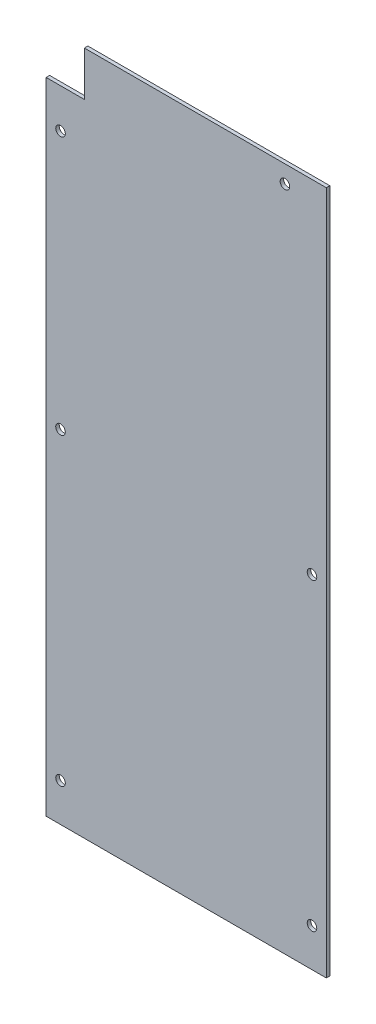
ISO-10303-21;
HEADER;
FILE_DESCRIPTION(('STEP AP214'),'2;1');
FILE_NAME('part.step','',(''),(''),'','','');
FILE_SCHEMA(('AUTOMOTIVE_DESIGN { 1 0 10303 214 1 1 1 1 }'));
ENDSEC;
DATA;
#1=APPLICATION_CONTEXT('core data for automotive mechanical design processes');
#2=APPLICATION_PROTOCOL_DEFINITION('international standard','automotive_design',2000,#1);
#3=PRODUCT_CONTEXT('',#1,'mechanical');
#4=PRODUCT('Part','Part','',(#3));
#5=PRODUCT_RELATED_PRODUCT_CATEGORY('part','',(#4));
#6=PRODUCT_DEFINITION_FORMATION('','',#4);
#7=PRODUCT_DEFINITION_CONTEXT('part definition',#1,'design');
#8=PRODUCT_DEFINITION('design','',#6,#7);
#9=PRODUCT_DEFINITION_SHAPE('','',#8);
#10=(LENGTH_UNIT() NAMED_UNIT(*) SI_UNIT(.MILLI.,.METRE.));
#11=(NAMED_UNIT(*) PLANE_ANGLE_UNIT() SI_UNIT($,.RADIAN.));
#12=(NAMED_UNIT(*) SI_UNIT($,.STERADIAN.) SOLID_ANGLE_UNIT());
#13=UNCERTAINTY_MEASURE_WITH_UNIT(LENGTH_MEASURE(1.E-05),#10,'distance_accuracy_value','');
#14=(GEOMETRIC_REPRESENTATION_CONTEXT(3) GLOBAL_UNCERTAINTY_ASSIGNED_CONTEXT((#13)) GLOBAL_UNIT_ASSIGNED_CONTEXT((#10,
#11,#12)) REPRESENTATION_CONTEXT('',''));
#15=CARTESIAN_POINT('',(0.,0.,0.));
#16=DIRECTION('',(0.,0.,1.));
#17=DIRECTION('',(1.,0.,0.));
#18=AXIS2_PLACEMENT_3D('',#15,#16,#17);
#19=CARTESIAN_POINT('',(-43.4054880311596,36.5751828079822,1.1));
#20=DIRECTION('',(1.,0.,0.));
#21=DIRECTION('',(0.,0.,-1.));
#22=AXIS2_PLACEMENT_3D('',#19,#20,#21);
#23=PLANE('',#22);
#24=DIRECTION('',(0.,-1.,0.));
#25=VECTOR('',#24,1.);
#26=CARTESIAN_POINT('',(-43.4054880311596,36.5751828079822,1.1));
#27=LINE('',#26,#25);
#28=CARTESIAN_POINT('',(-43.4054880311596,22.5761319376729,1.1));
#29=VERTEX_POINT('',#28);
#30=CARTESIAN_POINT('',(-43.4054880311596,-178.424817192018,1.1));
#31=VERTEX_POINT('',#30);
#32=EDGE_CURVE('E92',#29,#31,#27,.T.);
#33=ORIENTED_EDGE('',*,*,#32,.F.);
#34=DIRECTION('',(0.,0.,1.));
#35=VECTOR('',#34,1.);
#36=CARTESIAN_POINT('',(-43.4054880311596,22.5761319376729,0.));
#37=LINE('',#36,#35);
#38=CARTESIAN_POINT('',(-43.4054880311596,22.5761319376729,0.));
#39=VERTEX_POINT('',#38);
#40=EDGE_CURVE('E110',#39,#29,#37,.T.);
#41=ORIENTED_EDGE('',*,*,#40,.F.);
#42=DIRECTION('',(0.,-1.,0.));
#43=VECTOR('',#42,1.);
#44=CARTESIAN_POINT('',(-43.4054880311596,36.5751828079822,0.));
#45=LINE('',#44,#43);
#46=CARTESIAN_POINT('',(-43.4054880311596,-178.424817192018,0.));
#47=VERTEX_POINT('',#46);
#48=EDGE_CURVE('E118',#39,#47,#45,.T.);
#49=ORIENTED_EDGE('',*,*,#48,.T.);
#50=DIRECTION('',(0.,0.,-1.));
#51=VECTOR('',#50,1.);
#52=CARTESIAN_POINT('',(-43.4054880311596,-178.424817192018,1.1));
#53=LINE('',#52,#51);
#54=EDGE_CURVE('E12',#31,#47,#53,.T.);
#55=ORIENTED_EDGE('',*,*,#54,.F.);
#56=EDGE_LOOP('',(#33,#41,#49,#55));
#57=FACE_BOUND('',#56,.T.);
#58=ADVANCED_FACE('F44',(#57),#23,.F.);
#59=CARTESIAN_POINT('',(-43.4054880311596,-178.424817192018,1.1));
#60=DIRECTION('',(0.,1.,0.));
#61=DIRECTION('',(-1.,0.,0.));
#62=AXIS2_PLACEMENT_3D('',#59,#60,#61);
#63=PLANE('',#62);
#64=DIRECTION('',(1.,0.,0.));
#65=VECTOR('',#64,1.);
#66=CARTESIAN_POINT('',(-43.4054880311596,-178.424817192018,0.));
#67=LINE('',#66,#65);
#68=CARTESIAN_POINT('',(44.5945119688404,-178.424817192018,0.));
#69=VERTEX_POINT('',#68);
#70=EDGE_CURVE('E123',#47,#69,#67,.T.);
#71=ORIENTED_EDGE('',*,*,#70,.T.);
#72=DIRECTION('',(0.,0.,-1.));
#73=VECTOR('',#72,1.);
#74=CARTESIAN_POINT('',(44.5945119688404,-178.424817192018,1.1));
#75=LINE('',#74,#73);
#76=CARTESIAN_POINT('',(44.5945119688404,-178.424817192018,1.1));
#77=VERTEX_POINT('',#76);
#78=EDGE_CURVE('E53',#77,#69,#75,.T.);
#79=ORIENTED_EDGE('',*,*,#78,.F.);
#80=DIRECTION('',(1.,0.,0.));
#81=VECTOR('',#80,1.);
#82=CARTESIAN_POINT('',(-43.4054880311596,-178.424817192018,1.1));
#83=LINE('',#82,#81);
#84=EDGE_CURVE('E146',#31,#77,#83,.T.);
#85=ORIENTED_EDGE('',*,*,#84,.F.);
#86=ORIENTED_EDGE('',*,*,#54,.T.);
#87=EDGE_LOOP('',(#71,#79,#85,#86));
#88=FACE_BOUND('',#87,.T.);
#89=ADVANCED_FACE('F243',(#88),#63,.F.);
#90=CARTESIAN_POINT('',(44.5945119688404,36.5751828079822,1.1));
#91=DIRECTION('',(-1.,0.,0.));
#92=DIRECTION('',(0.,0.,1.));
#93=AXIS2_PLACEMENT_3D('',#90,#91,#92);
#94=PLANE('',#93);
#95=DIRECTION('',(0.,1.,0.));
#96=VECTOR('',#95,1.);
#97=CARTESIAN_POINT('',(44.5945119688404,36.5751828079822,0.));
#98=LINE('',#97,#96);
#99=CARTESIAN_POINT('',(44.5945119688404,36.5751828079822,0.));
#100=VERTEX_POINT('',#99);
#101=EDGE_CURVE('E87',#69,#100,#98,.T.);
#102=ORIENTED_EDGE('',*,*,#101,.T.);
#103=DIRECTION('',(0.,0.,-1.));
#104=VECTOR('',#103,1.);
#105=CARTESIAN_POINT('',(44.5945119688404,36.5751828079822,1.1));
#106=LINE('',#105,#104);
#107=CARTESIAN_POINT('',(44.5945119688404,36.5751828079822,1.1));
#108=VERTEX_POINT('',#107);
#109=EDGE_CURVE('E138',#108,#100,#106,.T.);
#110=ORIENTED_EDGE('',*,*,#109,.F.);
#111=DIRECTION('',(0.,1.,0.));
#112=VECTOR('',#111,1.);
#113=CARTESIAN_POINT('',(44.5945119688404,36.5751828079822,1.1));
#114=LINE('',#113,#112);
#115=EDGE_CURVE('E70',#77,#108,#114,.T.);
#116=ORIENTED_EDGE('',*,*,#115,.F.);
#117=ORIENTED_EDGE('',*,*,#78,.T.);
#118=EDGE_LOOP('',(#102,#110,#116,#117));
#119=FACE_BOUND('',#118,.T.);
#120=ADVANCED_FACE('F140',(#119),#94,.F.);
#121=CARTESIAN_POINT('',(-43.4054880311596,36.5751828079822,1.1));
#122=DIRECTION('',(0.,-1.,0.));
#123=DIRECTION('',(0.,0.,-1.));
#124=AXIS2_PLACEMENT_3D('',#121,#122,#123);
#125=PLANE('',#124);
#126=DIRECTION('',(-1.,0.,0.));
#127=VECTOR('',#126,1.);
#128=CARTESIAN_POINT('',(-43.4054880311596,36.5751828079822,0.));
#129=LINE('',#128,#127);
#130=CARTESIAN_POINT('',(-31.4054880311596,36.5751828079822,0.));
#131=VERTEX_POINT('',#130);
#132=EDGE_CURVE('E47',#100,#131,#129,.T.);
#133=ORIENTED_EDGE('',*,*,#132,.T.);
#134=DIRECTION('',(0.,0.,1.));
#135=VECTOR('',#134,1.);
#136=CARTESIAN_POINT('',(-31.4054880311596,36.5751828079822,0.));
#137=LINE('',#136,#135);
#138=CARTESIAN_POINT('',(-31.4054880311596,36.5751828079822,1.1));
#139=VERTEX_POINT('',#138);
#140=EDGE_CURVE('E155',#131,#139,#137,.T.);
#141=ORIENTED_EDGE('',*,*,#140,.T.);
#142=DIRECTION('',(-1.,0.,0.));
#143=VECTOR('',#142,1.);
#144=CARTESIAN_POINT('',(-43.4054880311596,36.5751828079822,1.1));
#145=LINE('',#144,#143);
#146=EDGE_CURVE('E133',#108,#139,#145,.T.);
#147=ORIENTED_EDGE('',*,*,#146,.F.);
#148=ORIENTED_EDGE('',*,*,#109,.T.);
#149=EDGE_LOOP('',(#133,#141,#147,#148));
#150=FACE_BOUND('',#149,.T.);
#151=ADVANCED_FACE('F154',(#150),#125,.F.);
#152=CARTESIAN_POINT('',(0.,0.,1.1));
#153=DIRECTION('',(0.,0.,1.));
#154=DIRECTION('',(1.,0.,0.));
#155=AXIS2_PLACEMENT_3D('',#152,#153,#154);
#156=PLANE('',#155);
#157=CARTESIAN_POINT('',(40.0945119688404,-166.424817192018,1.1));
#158=DIRECTION('',(0.,0.,1.));
#159=DIRECTION('',(1.,0.,0.));
#160=AXIS2_PLACEMENT_3D('',#157,#158,#159);
#161=CIRCLE('',#160,1.5);
#162=CARTESIAN_POINT('',(41.5945119688404,-166.424817192018,1.1));
#163=VERTEX_POINT('',#162);
#164=EDGE_CURVE('E124',#163,#163,#161,.T.);
#165=ORIENTED_EDGE('',*,*,#164,.F.);
#166=EDGE_LOOP('',(#165));
#167=FACE_BOUND('',#166,.T.);
#168=CARTESIAN_POINT('',(40.0945119688404,-70.9248171920178,1.1));
#169=DIRECTION('',(0.,0.,1.));
#170=DIRECTION('',(1.,0.,0.));
#171=AXIS2_PLACEMENT_3D('',#168,#169,#170);
#172=CIRCLE('',#171,1.5);
#173=CARTESIAN_POINT('',(41.5945119688404,-70.9248171920178,1.1));
#174=VERTEX_POINT('',#173);
#175=EDGE_CURVE('E127',#174,#174,#172,.T.);
#176=ORIENTED_EDGE('',*,*,#175,.F.);
#177=EDGE_LOOP('',(#176));
#178=FACE_BOUND('',#177,.T.);
#179=CARTESIAN_POINT('',(-38.9054880311596,10.2551828079822,1.1));
#180=DIRECTION('',(0.,0.,1.));
#181=DIRECTION('',(1.,0.,0.));
#182=AXIS2_PLACEMENT_3D('',#179,#180,#181);
#183=CIRCLE('',#182,1.50000000000198);
#184=CARTESIAN_POINT('',(-37.4054880311576,10.2551828079822,1.1));
#185=VERTEX_POINT('',#184);
#186=EDGE_CURVE('E180',#185,#185,#183,.T.);
#187=ORIENTED_EDGE('',*,*,#186,.F.);
#188=EDGE_LOOP('',(#187));
#189=FACE_BOUND('',#188,.T.);
#190=CARTESIAN_POINT('',(-38.9054880311596,-70.9248171920178,1.1));
#191=DIRECTION('',(0.,0.,1.));
#192=DIRECTION('',(1.,0.,0.));
#193=AXIS2_PLACEMENT_3D('',#190,#191,#192);
#194=CIRCLE('',#193,1.5);
#195=CARTESIAN_POINT('',(-37.4054880311596,-70.9248171920178,1.1));
#196=VERTEX_POINT('',#195);
#197=EDGE_CURVE('E177',#196,#196,#194,.T.);
#198=ORIENTED_EDGE('',*,*,#197,.F.);
#199=EDGE_LOOP('',(#198));
#200=FACE_BOUND('',#199,.T.);
#201=CARTESIAN_POINT('',(-38.9054880311596,-166.424817192018,1.1));
#202=DIRECTION('',(0.,0.,1.));
#203=DIRECTION('',(1.,0.,0.));
#204=AXIS2_PLACEMENT_3D('',#201,#202,#203);
#205=CIRCLE('',#204,1.5);
#206=CARTESIAN_POINT('',(-37.4054880311596,-166.424817192018,1.1));
#207=VERTEX_POINT('',#206);
#208=EDGE_CURVE('E174',#207,#207,#205,.T.);
#209=ORIENTED_EDGE('',*,*,#208,.F.);
#210=EDGE_LOOP('',(#209));
#211=FACE_BOUND('',#210,.T.);
#212=CARTESIAN_POINT('',(31.5945119688404,31.0751828079823,1.1));
#213=DIRECTION('',(0.,0.,1.));
#214=DIRECTION('',(1.,0.,0.));
#215=AXIS2_PLACEMENT_3D('',#212,#213,#214);
#216=CIRCLE('',#215,1.50000000000098);
#217=CARTESIAN_POINT('',(33.0945119688414,31.0751828079823,1.1));
#218=VERTEX_POINT('',#217);
#219=EDGE_CURVE('E171',#218,#218,#216,.T.);
#220=ORIENTED_EDGE('',*,*,#219,.F.);
#221=EDGE_LOOP('',(#220));
#222=FACE_BOUND('',#221,.T.);
#223=DIRECTION('',(0.,1.,0.));
#224=VECTOR('',#223,1.);
#225=CARTESIAN_POINT('',(-31.4054880311596,0.,1.1));
#226=LINE('',#225,#224);
#227=CARTESIAN_POINT('',(-31.4054880311596,22.5761319376729,1.1));
#228=VERTEX_POINT('',#227);
#229=EDGE_CURVE('E153',#228,#139,#226,.T.);
#230=ORIENTED_EDGE('',*,*,#229,.F.);
#231=DIRECTION('',(1.,0.,0.));
#232=VECTOR('',#231,1.);
#233=CARTESIAN_POINT('',(0.,22.5761319376729,1.1));
#234=LINE('',#233,#232);
#235=EDGE_CURVE('E114',#29,#228,#234,.T.);
#236=ORIENTED_EDGE('',*,*,#235,.F.);
#237=ORIENTED_EDGE('',*,*,#32,.T.);
#238=ORIENTED_EDGE('',*,*,#84,.T.);
#239=ORIENTED_EDGE('',*,*,#115,.T.);
#240=ORIENTED_EDGE('',*,*,#146,.T.);
#241=EDGE_LOOP('',(#230,#236,#237,#238,#239,#240));
#242=FACE_BOUND('',#241,.T.);
#243=ADVANCED_FACE('F152',(#167,#178,#189,#200,#211,#222,#242),#156,.T.);
#244=CARTESIAN_POINT('',(0.,0.,0.));
#245=DIRECTION('',(0.,0.,1.));
#246=DIRECTION('',(1.,0.,0.));
#247=AXIS2_PLACEMENT_3D('',#244,#245,#246);
#248=PLANE('',#247);
#249=CARTESIAN_POINT('',(40.0945119688404,-166.424817192018,0.));
#250=DIRECTION('',(0.,0.,1.));
#251=DIRECTION('',(1.,0.,0.));
#252=AXIS2_PLACEMENT_3D('',#249,#250,#251);
#253=CIRCLE('',#252,1.5);
#254=CARTESIAN_POINT('',(41.5945119688404,-166.424817192018,0.));
#255=VERTEX_POINT('',#254);
#256=EDGE_CURVE('E216',#255,#255,#253,.T.);
#257=ORIENTED_EDGE('',*,*,#256,.T.);
#258=EDGE_LOOP('',(#257));
#259=FACE_BOUND('',#258,.T.);
#260=CARTESIAN_POINT('',(40.0945119688404,-70.9248171920178,0.));
#261=DIRECTION('',(0.,0.,1.));
#262=DIRECTION('',(1.,0.,0.));
#263=AXIS2_PLACEMENT_3D('',#260,#261,#262);
#264=CIRCLE('',#263,1.5);
#265=CARTESIAN_POINT('',(41.5945119688404,-70.9248171920178,0.));
#266=VERTEX_POINT('',#265);
#267=EDGE_CURVE('E211',#266,#266,#264,.T.);
#268=ORIENTED_EDGE('',*,*,#267,.T.);
#269=EDGE_LOOP('',(#268));
#270=FACE_BOUND('',#269,.T.);
#271=CARTESIAN_POINT('',(-38.9054880311596,10.2551828079822,0.));
#272=DIRECTION('',(0.,0.,1.));
#273=DIRECTION('',(1.,0.,0.));
#274=AXIS2_PLACEMENT_3D('',#271,#272,#273);
#275=CIRCLE('',#274,1.50000000000198);
#276=CARTESIAN_POINT('',(-37.4054880311576,10.2551828079822,0.));
#277=VERTEX_POINT('',#276);
#278=EDGE_CURVE('E157',#277,#277,#275,.T.);
#279=ORIENTED_EDGE('',*,*,#278,.T.);
#280=EDGE_LOOP('',(#279));
#281=FACE_BOUND('',#280,.T.);
#282=CARTESIAN_POINT('',(-38.9054880311596,-70.9248171920178,0.));
#283=DIRECTION('',(0.,0.,1.));
#284=DIRECTION('',(1.,0.,0.));
#285=AXIS2_PLACEMENT_3D('',#282,#283,#284);
#286=CIRCLE('',#285,1.5);
#287=CARTESIAN_POINT('',(-37.4054880311596,-70.9248171920178,0.));
#288=VERTEX_POINT('',#287);
#289=EDGE_CURVE('E161',#288,#288,#286,.T.);
#290=ORIENTED_EDGE('',*,*,#289,.T.);
#291=EDGE_LOOP('',(#290));
#292=FACE_BOUND('',#291,.T.);
#293=CARTESIAN_POINT('',(-38.9054880311596,-166.424817192018,0.));
#294=DIRECTION('',(0.,0.,1.));
#295=DIRECTION('',(1.,0.,0.));
#296=AXIS2_PLACEMENT_3D('',#293,#294,#295);
#297=CIRCLE('',#296,1.5);
#298=CARTESIAN_POINT('',(-37.4054880311596,-166.424817192018,0.));
#299=VERTEX_POINT('',#298);
#300=EDGE_CURVE('E210',#299,#299,#297,.T.);
#301=ORIENTED_EDGE('',*,*,#300,.T.);
#302=EDGE_LOOP('',(#301));
#303=FACE_BOUND('',#302,.T.);
#304=CARTESIAN_POINT('',(31.5945119688404,31.0751828079823,-4.3298697960376E-13));
#305=DIRECTION('',(0.,0.,1.));
#306=DIRECTION('',(1.,0.,0.));
#307=AXIS2_PLACEMENT_3D('',#304,#305,#306);
#308=CIRCLE('',#307,1.50000000000098);
#309=CARTESIAN_POINT('',(33.0945119688414,31.0751828079823,-4.3298697960376E-13));
#310=VERTEX_POINT('',#309);
#311=EDGE_CURVE('E208',#310,#310,#308,.T.);
#312=ORIENTED_EDGE('',*,*,#311,.T.);
#313=EDGE_LOOP('',(#312));
#314=FACE_BOUND('',#313,.T.);
#315=DIRECTION('',(1.,0.,0.));
#316=VECTOR('',#315,1.);
#317=CARTESIAN_POINT('',(-43.4054880311596,22.5761319376729,0.));
#318=LINE('',#317,#316);
#319=CARTESIAN_POINT('',(-31.4054880311596,22.5761319376729,0.));
#320=VERTEX_POINT('',#319);
#321=EDGE_CURVE('E107',#39,#320,#318,.T.);
#322=ORIENTED_EDGE('',*,*,#321,.T.);
#323=DIRECTION('',(0.,1.,0.));
#324=VECTOR('',#323,1.);
#325=CARTESIAN_POINT('',(-31.4054880311596,36.5751828079822,0.));
#326=LINE('',#325,#324);
#327=EDGE_CURVE('E120',#320,#131,#326,.T.);
#328=ORIENTED_EDGE('',*,*,#327,.T.);
#329=ORIENTED_EDGE('',*,*,#132,.F.);
#330=ORIENTED_EDGE('',*,*,#101,.F.);
#331=ORIENTED_EDGE('',*,*,#70,.F.);
#332=ORIENTED_EDGE('',*,*,#48,.F.);
#333=EDGE_LOOP('',(#322,#328,#329,#330,#331,#332));
#334=FACE_BOUND('',#333,.T.);
#335=ADVANCED_FACE('F122',(#259,#270,#281,#292,#303,#314,#334),#248,.F.);
#336=CARTESIAN_POINT('',(-31.4054880311596,36.5751828079822,0.));
#337=DIRECTION('',(1.,0.,0.));
#338=DIRECTION('',(0.,0.,-1.));
#339=AXIS2_PLACEMENT_3D('',#336,#337,#338);
#340=PLANE('',#339);
#341=ORIENTED_EDGE('',*,*,#229,.T.);
#342=ORIENTED_EDGE('',*,*,#140,.F.);
#343=ORIENTED_EDGE('',*,*,#327,.F.);
#344=DIRECTION('',(0.,0.,1.));
#345=VECTOR('',#344,1.);
#346=CARTESIAN_POINT('',(-31.4054880311596,22.5761319376729,0.));
#347=LINE('',#346,#345);
#348=EDGE_CURVE('E61',#320,#228,#347,.T.);
#349=ORIENTED_EDGE('',*,*,#348,.T.);
#350=EDGE_LOOP('',(#341,#342,#343,#349));
#351=FACE_BOUND('',#350,.T.);
#352=ADVANCED_FACE('F205',(#351),#340,.F.);
#353=CARTESIAN_POINT('',(-43.4054880311596,22.5761319376729,0.));
#354=DIRECTION('',(0.,-1.,0.));
#355=DIRECTION('',(1.,0.,0.));
#356=AXIS2_PLACEMENT_3D('',#353,#354,#355);
#357=PLANE('',#356);
#358=ORIENTED_EDGE('',*,*,#235,.T.);
#359=ORIENTED_EDGE('',*,*,#348,.F.);
#360=ORIENTED_EDGE('',*,*,#321,.F.);
#361=ORIENTED_EDGE('',*,*,#40,.T.);
#362=EDGE_LOOP('',(#358,#359,#360,#361));
#363=FACE_BOUND('',#362,.T.);
#364=ADVANCED_FACE('F109',(#363),#357,.F.);
#365=CARTESIAN_POINT('',(31.5945119688404,31.0751828079823,-4.3298697960376E-13));
#366=DIRECTION('',(0.,0.,1.));
#367=DIRECTION('',(1.,0.,0.));
#368=AXIS2_PLACEMENT_3D('',#365,#366,#367);
#369=CYLINDRICAL_SURFACE('',#368,1.50000000000098);
#370=ORIENTED_EDGE('',*,*,#219,.T.);
#371=EDGE_LOOP('',(#370));
#372=FACE_BOUND('',#371,.T.);
#373=ORIENTED_EDGE('',*,*,#311,.F.);
#374=EDGE_LOOP('',(#373));
#375=FACE_BOUND('',#374,.T.);
#376=ADVANCED_FACE('F200',(#372,#375),#369,.F.);
#377=CARTESIAN_POINT('',(-38.9054880311596,-166.424817192018,0.));
#378=DIRECTION('',(0.,0.,1.));
#379=DIRECTION('',(1.,0.,0.));
#380=AXIS2_PLACEMENT_3D('',#377,#378,#379);
#381=CYLINDRICAL_SURFACE('',#380,1.5);
#382=ORIENTED_EDGE('',*,*,#208,.T.);
#383=EDGE_LOOP('',(#382));
#384=FACE_BOUND('',#383,.T.);
#385=ORIENTED_EDGE('',*,*,#300,.F.);
#386=EDGE_LOOP('',(#385));
#387=FACE_BOUND('',#386,.T.);
#388=ADVANCED_FACE('F203',(#384,#387),#381,.F.);
#389=CARTESIAN_POINT('',(-38.9054880311596,-70.9248171920178,0.));
#390=DIRECTION('',(0.,0.,1.));
#391=DIRECTION('',(1.,0.,0.));
#392=AXIS2_PLACEMENT_3D('',#389,#390,#391);
#393=CYLINDRICAL_SURFACE('',#392,1.5);
#394=ORIENTED_EDGE('',*,*,#197,.T.);
#395=EDGE_LOOP('',(#394));
#396=FACE_BOUND('',#395,.T.);
#397=ORIENTED_EDGE('',*,*,#289,.F.);
#398=EDGE_LOOP('',(#397));
#399=FACE_BOUND('',#398,.T.);
#400=ADVANCED_FACE('F276',(#396,#399),#393,.F.);
#401=CARTESIAN_POINT('',(-38.9054880311596,10.2551828079822,0.));
#402=DIRECTION('',(0.,0.,1.));
#403=DIRECTION('',(1.,0.,0.));
#404=AXIS2_PLACEMENT_3D('',#401,#402,#403);
#405=CYLINDRICAL_SURFACE('',#404,1.50000000000198);
#406=ORIENTED_EDGE('',*,*,#186,.T.);
#407=EDGE_LOOP('',(#406));
#408=FACE_BOUND('',#407,.T.);
#409=ORIENTED_EDGE('',*,*,#278,.F.);
#410=EDGE_LOOP('',(#409));
#411=FACE_BOUND('',#410,.T.);
#412=ADVANCED_FACE('F239',(#408,#411),#405,.F.);
#413=CARTESIAN_POINT('',(40.0945119688404,-70.9248171920178,0.));
#414=DIRECTION('',(0.,0.,1.));
#415=DIRECTION('',(1.,0.,0.));
#416=AXIS2_PLACEMENT_3D('',#413,#414,#415);
#417=CYLINDRICAL_SURFACE('',#416,1.5);
#418=ORIENTED_EDGE('',*,*,#175,.T.);
#419=EDGE_LOOP('',(#418));
#420=FACE_BOUND('',#419,.T.);
#421=ORIENTED_EDGE('',*,*,#267,.F.);
#422=EDGE_LOOP('',(#421));
#423=FACE_BOUND('',#422,.T.);
#424=ADVANCED_FACE('F185',(#420,#423),#417,.F.);
#425=CARTESIAN_POINT('',(40.0945119688404,-166.424817192018,0.));
#426=DIRECTION('',(0.,0.,1.));
#427=DIRECTION('',(1.,0.,0.));
#428=AXIS2_PLACEMENT_3D('',#425,#426,#427);
#429=CYLINDRICAL_SURFACE('',#428,1.5);
#430=ORIENTED_EDGE('',*,*,#164,.T.);
#431=EDGE_LOOP('',(#430));
#432=FACE_BOUND('',#431,.T.);
#433=ORIENTED_EDGE('',*,*,#256,.F.);
#434=EDGE_LOOP('',(#433));
#435=FACE_BOUND('',#434,.T.);
#436=ADVANCED_FACE('F232',(#432,#435),#429,.F.);
#437=CLOSED_SHELL('',(#58,#89,#120,#151,#243,#335,#352,#364,#376,#388,#400,#412,#424,#436));
#438=MANIFOLD_SOLID_BREP('B2',#437);
#439=ADVANCED_BREP_SHAPE_REPRESENTATION('',(#18,#438),#14);
#440=SHAPE_DEFINITION_REPRESENTATION(#9,#439);
ENDSEC;
END-ISO-10303-21;
